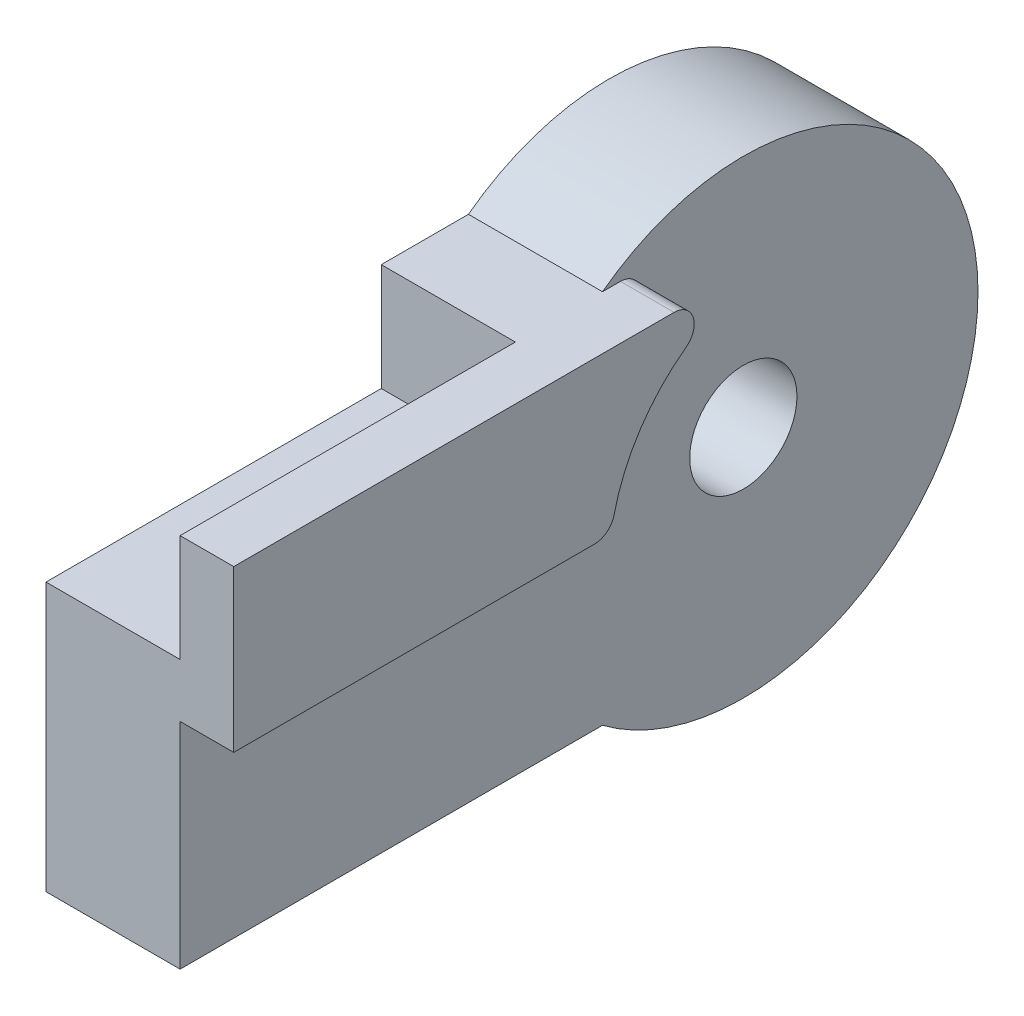
ISO-10303-21;
HEADER;
FILE_DESCRIPTION(('STEP AP214'),'2;1');
FILE_NAME('part.step','',(''),(''),'','','');
FILE_SCHEMA(('AUTOMOTIVE_DESIGN { 1 0 10303 214 1 1 1 1 }'));
ENDSEC;
DATA;
#1=APPLICATION_CONTEXT('core data for automotive mechanical design processes');
#2=APPLICATION_PROTOCOL_DEFINITION('international standard','automotive_design',2000,#1);
#3=PRODUCT_CONTEXT('',#1,'mechanical');
#4=PRODUCT('Part','Part','',(#3));
#5=PRODUCT_RELATED_PRODUCT_CATEGORY('part','',(#4));
#6=PRODUCT_DEFINITION_FORMATION('','',#4);
#7=PRODUCT_DEFINITION_CONTEXT('part definition',#1,'design');
#8=PRODUCT_DEFINITION('design','',#6,#7);
#9=PRODUCT_DEFINITION_SHAPE('','',#8);
#10=(LENGTH_UNIT() NAMED_UNIT(*) SI_UNIT(.MILLI.,.METRE.));
#11=(NAMED_UNIT(*) PLANE_ANGLE_UNIT() SI_UNIT($,.RADIAN.));
#12=(NAMED_UNIT(*) SI_UNIT($,.STERADIAN.) SOLID_ANGLE_UNIT());
#13=UNCERTAINTY_MEASURE_WITH_UNIT(LENGTH_MEASURE(1.E-05),#10,'distance_accuracy_value','');
#14=(GEOMETRIC_REPRESENTATION_CONTEXT(3) GLOBAL_UNCERTAINTY_ASSIGNED_CONTEXT((#13)) GLOBAL_UNIT_ASSIGNED_CONTEXT((#10,
#11,#12)) REPRESENTATION_CONTEXT('',''));
#15=CARTESIAN_POINT('',(0.,0.,0.));
#16=DIRECTION('',(0.,0.,1.));
#17=DIRECTION('',(1.,0.,0.));
#18=AXIS2_PLACEMENT_3D('',#15,#16,#17);
#19=CARTESIAN_POINT('',(0.5,-1.4,0.916515138991168));
#20=DIRECTION('',(-1.,0.,0.));
#21=DIRECTION('',(0.,0.,1.));
#22=AXIS2_PLACEMENT_3D('',#19,#20,#21);
#23=PLANE('',#22);
#24=DIRECTION('',(0.,0.,-1.));
#25=VECTOR('',#24,1.);
#26=CARTESIAN_POINT('',(0.5,1.4,0.));
#27=LINE('',#26,#25);
#28=CARTESIAN_POINT('',(0.5,1.4,1.7));
#29=VERTEX_POINT('',#28);
#30=CARTESIAN_POINT('',(0.5,1.4,1.05));
#31=VERTEX_POINT('',#30);
#32=EDGE_CURVE('E135',#29,#31,#27,.T.);
#33=ORIENTED_EDGE('',*,*,#32,.T.);
#34=CARTESIAN_POINT('',(0.5,0.,0.));
#35=DIRECTION('',(1.,0.,0.));
#36=DIRECTION('',(0.,0.,-1.));
#37=AXIS2_PLACEMENT_3D('',#34,#35,#36);
#38=CIRCLE('',#37,1.75);
#39=CARTESIAN_POINT('',(0.5,-1.4,1.05));
#40=VERTEX_POINT('',#39);
#41=EDGE_CURVE('E127',#31,#40,#38,.F.);
#42=ORIENTED_EDGE('',*,*,#41,.T.);
#43=DIRECTION('',(0.,0.,-1.));
#44=VECTOR('',#43,1.);
#45=CARTESIAN_POINT('',(0.5,-1.4,0.));
#46=LINE('',#45,#44);
#47=CARTESIAN_POINT('',(0.5,-1.4,4.2));
#48=VERTEX_POINT('',#47);
#49=EDGE_CURVE('E131',#48,#40,#46,.T.);
#50=ORIENTED_EDGE('',*,*,#49,.F.);
#51=DIRECTION('',(0.,-1.,0.));
#52=VECTOR('',#51,1.);
#53=CARTESIAN_POINT('',(0.5,0.,4.2));
#54=LINE('',#53,#52);
#55=CARTESIAN_POINT('',(0.5,0.6,4.2));
#56=VERTEX_POINT('',#55);
#57=EDGE_CURVE('E152',#56,#48,#54,.T.);
#58=ORIENTED_EDGE('',*,*,#57,.F.);
#59=DIRECTION('',(0.,0.,1.));
#60=VECTOR('',#59,1.);
#61=CARTESIAN_POINT('',(0.5,0.6,0.));
#62=LINE('',#61,#60);
#63=CARTESIAN_POINT('',(0.5,0.6,1.7));
#64=VERTEX_POINT('',#63);
#65=EDGE_CURVE('E160',#64,#56,#62,.T.);
#66=ORIENTED_EDGE('',*,*,#65,.F.);
#67=DIRECTION('',(0.,-1.,0.));
#68=VECTOR('',#67,1.);
#69=CARTESIAN_POINT('',(0.5,0.,1.7));
#70=LINE('',#69,#68);
#71=EDGE_CURVE('E156',#29,#64,#70,.T.);
#72=ORIENTED_EDGE('',*,*,#71,.F.);
#73=EDGE_LOOP('',(#33,#42,#50,#58,#66,#72));
#74=FACE_BOUND('',#73,.T.);
#75=CARTESIAN_POINT('',(0.5,0.,0.));
#76=DIRECTION('',(1.,0.,0.));
#77=DIRECTION('',(0.,0.,-1.));
#78=AXIS2_PLACEMENT_3D('',#75,#76,#77);
#79=CIRCLE('',#78,0.4);
#80=CARTESIAN_POINT('',(0.5,0.,-0.4));
#81=VERTEX_POINT('',#80);
#82=EDGE_CURVE('E204',#81,#81,#79,.T.);
#83=ORIENTED_EDGE('',*,*,#82,.T.);
#84=EDGE_LOOP('',(#83));
#85=FACE_BOUND('',#84,.T.);
#86=ADVANCED_FACE('F39',(#74,#85),#23,.T.);
#87=CARTESIAN_POINT('',(5.43847096529504,0.6,0.));
#88=DIRECTION('',(0.,1.,0.));
#89=DIRECTION('',(0.,0.,1.));
#90=AXIS2_PLACEMENT_3D('',#87,#88,#89);
#91=PLANE('',#90);
#92=DIRECTION('',(-1.,0.,0.));
#93=VECTOR('',#92,1.);
#94=CARTESIAN_POINT('',(5.43847096529504,0.6,1.7));
#95=LINE('',#94,#93);
#96=CARTESIAN_POINT('',(1.5,0.6,1.7));
#97=VERTEX_POINT('',#96);
#98=EDGE_CURVE('E169',#97,#64,#95,.T.);
#99=ORIENTED_EDGE('',*,*,#98,.T.);
#100=ORIENTED_EDGE('',*,*,#65,.T.);
#101=DIRECTION('',(-1.,0.,0.));
#102=VECTOR('',#101,1.);
#103=CARTESIAN_POINT('',(5.43847096529504,0.6,4.2));
#104=LINE('',#103,#102);
#105=CARTESIAN_POINT('',(1.5,0.6,4.2));
#106=VERTEX_POINT('',#105);
#107=EDGE_CURVE('E172',#106,#56,#104,.T.);
#108=ORIENTED_EDGE('',*,*,#107,.F.);
#109=DIRECTION('',(0.,0.,-1.));
#110=VECTOR('',#109,1.);
#111=CARTESIAN_POINT('',(1.5,0.6,0.));
#112=LINE('',#111,#110);
#113=EDGE_CURVE('E187',#106,#97,#112,.T.);
#114=ORIENTED_EDGE('',*,*,#113,.T.);
#115=EDGE_LOOP('',(#99,#100,#108,#114));
#116=FACE_BOUND('',#115,.T.);
#117=ADVANCED_FACE('F264',(#116),#91,.T.);
#118=CARTESIAN_POINT('',(5.43847096529504,0.,1.7));
#119=DIRECTION('',(0.,0.,1.));
#120=DIRECTION('',(1.,0.,0.));
#121=AXIS2_PLACEMENT_3D('',#118,#119,#120);
#122=PLANE('',#121);
#123=DIRECTION('',(-1.,0.,0.));
#124=VECTOR('',#123,1.);
#125=CARTESIAN_POINT('',(5.43847096529504,1.4,1.7));
#126=LINE('',#125,#124);
#127=CARTESIAN_POINT('',(1.5,1.4,1.7));
#128=VERTEX_POINT('',#127);
#129=EDGE_CURVE('E167',#128,#29,#126,.T.);
#130=ORIENTED_EDGE('',*,*,#129,.T.);
#131=ORIENTED_EDGE('',*,*,#71,.T.);
#132=ORIENTED_EDGE('',*,*,#98,.F.);
#133=DIRECTION('',(0.,1.,0.));
#134=VECTOR('',#133,1.);
#135=CARTESIAN_POINT('',(1.5,0.,1.7));
#136=LINE('',#135,#134);
#137=EDGE_CURVE('E193',#97,#128,#136,.T.);
#138=ORIENTED_EDGE('',*,*,#137,.T.);
#139=EDGE_LOOP('',(#130,#131,#132,#138));
#140=FACE_BOUND('',#139,.T.);
#141=ADVANCED_FACE('F261',(#140),#122,.T.);
#142=CARTESIAN_POINT('',(1.5,0.,4.2));
#143=DIRECTION('',(0.,0.,1.));
#144=DIRECTION('',(1.,0.,0.));
#145=AXIS2_PLACEMENT_3D('',#142,#143,#144);
#146=PLANE('',#145);
#147=ORIENTED_EDGE('',*,*,#107,.T.);
#148=ORIENTED_EDGE('',*,*,#57,.T.);
#149=DIRECTION('',(-1.,0.,0.));
#150=VECTOR('',#149,1.);
#151=CARTESIAN_POINT('',(1.5,-1.4,4.2));
#152=LINE('',#151,#150);
#153=CARTESIAN_POINT('',(1.5,-1.4,4.2));
#154=VERTEX_POINT('',#153);
#155=EDGE_CURVE('E150',#154,#48,#152,.T.);
#156=ORIENTED_EDGE('',*,*,#155,.F.);
#157=DIRECTION('',(0.,1.,0.));
#158=VECTOR('',#157,1.);
#159=CARTESIAN_POINT('',(1.5,0.,4.2));
#160=LINE('',#159,#158);
#161=CARTESIAN_POINT('',(1.5,0.2,4.2));
#162=VERTEX_POINT('',#161);
#163=EDGE_CURVE('E223',#154,#162,#160,.T.);
#164=ORIENTED_EDGE('',*,*,#163,.T.);
#165=DIRECTION('',(-1.,0.,0.));
#166=VECTOR('',#165,1.);
#167=CARTESIAN_POINT('',(5.43847096529504,0.2,4.2));
#168=LINE('',#167,#166);
#169=CARTESIAN_POINT('',(1.9,0.2,4.2));
#170=VERTEX_POINT('',#169);
#171=EDGE_CURVE('E43',#170,#162,#168,.T.);
#172=ORIENTED_EDGE('',*,*,#171,.F.);
#173=DIRECTION('',(0.,1.,0.));
#174=VECTOR('',#173,1.);
#175=CARTESIAN_POINT('',(1.9,0.,4.2));
#176=LINE('',#175,#174);
#177=CARTESIAN_POINT('',(1.9,1.4,4.2));
#178=VERTEX_POINT('',#177);
#179=EDGE_CURVE('E174',#170,#178,#176,.T.);
#180=ORIENTED_EDGE('',*,*,#179,.T.);
#181=DIRECTION('',(-1.,0.,0.));
#182=VECTOR('',#181,1.);
#183=CARTESIAN_POINT('',(1.9,1.4,4.2));
#184=LINE('',#183,#182);
#185=CARTESIAN_POINT('',(1.5,1.4,4.2));
#186=VERTEX_POINT('',#185);
#187=EDGE_CURVE('E56',#178,#186,#184,.T.);
#188=ORIENTED_EDGE('',*,*,#187,.T.);
#189=DIRECTION('',(0.,-1.,0.));
#190=VECTOR('',#189,1.);
#191=CARTESIAN_POINT('',(1.5,0.,4.2));
#192=LINE('',#191,#190);
#193=EDGE_CURVE('E199',#186,#106,#192,.T.);
#194=ORIENTED_EDGE('',*,*,#193,.T.);
#195=EDGE_LOOP('',(#147,#148,#156,#164,#172,#180,#188,#194));
#196=FACE_BOUND('',#195,.T.);
#197=ADVANCED_FACE('F265',(#196),#146,.T.);
#198=CARTESIAN_POINT('',(1.5,-1.4,0.));
#199=DIRECTION('',(0.,-1.,0.));
#200=DIRECTION('',(0.,0.,-1.));
#201=AXIS2_PLACEMENT_3D('',#198,#199,#200);
#202=PLANE('',#201);
#203=ORIENTED_EDGE('',*,*,#155,.T.);
#204=ORIENTED_EDGE('',*,*,#49,.T.);
#205=DIRECTION('',(1.,0.,0.));
#206=VECTOR('',#205,1.);
#207=CARTESIAN_POINT('',(-4.44974746830583,-1.4,1.05));
#208=LINE('',#207,#206);
#209=CARTESIAN_POINT('',(1.5,-1.4,1.05));
#210=VERTEX_POINT('',#209);
#211=EDGE_CURVE('E142',#210,#40,#208,.F.);
#212=ORIENTED_EDGE('',*,*,#211,.F.);
#213=DIRECTION('',(0.,0.,1.));
#214=VECTOR('',#213,1.);
#215=CARTESIAN_POINT('',(1.5,-1.4,0.));
#216=LINE('',#215,#214);
#217=EDGE_CURVE('E165',#210,#154,#216,.T.);
#218=ORIENTED_EDGE('',*,*,#217,.T.);
#219=EDGE_LOOP('',(#203,#204,#212,#218));
#220=FACE_BOUND('',#219,.T.);
#221=ADVANCED_FACE('F41',(#220),#202,.T.);
#222=CARTESIAN_POINT('',(5.43847096529504,1.4,0.));
#223=DIRECTION('',(0.,-1.,0.));
#224=DIRECTION('',(0.,0.,-1.));
#225=AXIS2_PLACEMENT_3D('',#222,#223,#224);
#226=PLANE('',#225);
#227=ORIENTED_EDGE('',*,*,#32,.F.);
#228=ORIENTED_EDGE('',*,*,#129,.F.);
#229=DIRECTION('',(0.,0.,-1.));
#230=VECTOR('',#229,1.);
#231=CARTESIAN_POINT('',(1.5,1.4,0.));
#232=LINE('',#231,#230);
#233=EDGE_CURVE('E197',#186,#128,#232,.T.);
#234=ORIENTED_EDGE('',*,*,#233,.F.);
#235=ORIENTED_EDGE('',*,*,#187,.F.);
#236=DIRECTION('',(0.,0.,1.));
#237=VECTOR('',#236,1.);
#238=CARTESIAN_POINT('',(1.9,1.4,0.));
#239=LINE('',#238,#237);
#240=CARTESIAN_POINT('',(1.9,1.4,0.916515138991168));
#241=VERTEX_POINT('',#240);
#242=EDGE_CURVE('E185',#241,#178,#239,.T.);
#243=ORIENTED_EDGE('',*,*,#242,.F.);
#244=DIRECTION('',(1.,0.,0.));
#245=VECTOR('',#244,1.);
#246=CARTESIAN_POINT('',(1.5,1.4,0.916515138991168));
#247=LINE('',#246,#245);
#248=CARTESIAN_POINT('',(1.5,1.4,0.916515138991168));
#249=VERTEX_POINT('',#248);
#250=EDGE_CURVE('E217',#241,#249,#247,.F.);
#251=ORIENTED_EDGE('',*,*,#250,.T.);
#252=DIRECTION('',(0.,0.,1.));
#253=VECTOR('',#252,1.);
#254=CARTESIAN_POINT('',(1.5,1.4,0.));
#255=LINE('',#254,#253);
#256=CARTESIAN_POINT('',(1.5,1.4,1.05));
#257=VERTEX_POINT('',#256);
#258=EDGE_CURVE('E139',#249,#257,#255,.T.);
#259=ORIENTED_EDGE('',*,*,#258,.T.);
#260=DIRECTION('',(1.,0.,0.));
#261=VECTOR('',#260,1.);
#262=CARTESIAN_POINT('',(-4.44974746830583,1.4,1.05));
#263=LINE('',#262,#261);
#264=EDGE_CURVE('E49',#31,#257,#263,.T.);
#265=ORIENTED_EDGE('',*,*,#264,.F.);
#266=EDGE_LOOP('',(#227,#228,#234,#235,#243,#251,#259,#265));
#267=FACE_BOUND('',#266,.T.);
#268=ADVANCED_FACE('F211',(#267),#226,.F.);
#269=CARTESIAN_POINT('',(1.5,0.,0.));
#270=DIRECTION('',(-1.,0.,0.));
#271=DIRECTION('',(0.,0.,1.));
#272=AXIS2_PLACEMENT_3D('',#269,#270,#271);
#273=CYLINDRICAL_SURFACE('',#272,1.4);
#274=CARTESIAN_POINT('',(1.9,0.,0.));
#275=DIRECTION('',(1.,0.,0.));
#276=DIRECTION('',(0.,0.,-1.));
#277=AXIS2_PLACEMENT_3D('',#274,#275,#276);
#278=CIRCLE('',#277,1.4);
#279=CARTESIAN_POINT('',(1.9,1.12903225806452,0.82782012554041));
#280=VERTEX_POINT('',#279);
#281=CARTESIAN_POINT('',(1.9,0.316129032258065,1.36384105927472));
#282=VERTEX_POINT('',#281);
#283=EDGE_CURVE('E170',#280,#282,#278,.T.);
#284=ORIENTED_EDGE('',*,*,#283,.T.);
#285=DIRECTION('',(-1.,0.,0.));
#286=VECTOR('',#285,1.);
#287=CARTESIAN_POINT('',(1.5,0.316129032258065,1.36384105927472));
#288=LINE('',#287,#286);
#289=CARTESIAN_POINT('',(1.5,0.316129032258065,1.36384105927472));
#290=VERTEX_POINT('',#289);
#291=EDGE_CURVE('E227',#282,#290,#288,.T.);
#292=ORIENTED_EDGE('',*,*,#291,.T.);
#293=CARTESIAN_POINT('',(1.5,0.,0.));
#294=DIRECTION('',(1.,0.,0.));
#295=DIRECTION('',(0.,0.,-1.));
#296=AXIS2_PLACEMENT_3D('',#293,#294,#295);
#297=CIRCLE('',#296,1.4);
#298=CARTESIAN_POINT('',(1.5,1.12903225806452,0.82782012554041));
#299=VERTEX_POINT('',#298);
#300=EDGE_CURVE('E201',#299,#290,#297,.T.);
#301=ORIENTED_EDGE('',*,*,#300,.F.);
#302=DIRECTION('',(-1.,0.,0.));
#303=VECTOR('',#302,1.);
#304=CARTESIAN_POINT('',(1.5,1.12903225806452,0.82782012554041));
#305=LINE('',#304,#303);
#306=EDGE_CURVE('E166',#299,#280,#305,.F.);
#307=ORIENTED_EDGE('',*,*,#306,.T.);
#308=EDGE_LOOP('',(#284,#292,#301,#307));
#309=FACE_BOUND('',#308,.T.);
#310=ADVANCED_FACE('F252',(#309),#273,.F.);
#311=CARTESIAN_POINT('',(1.5,0.,0.));
#312=DIRECTION('',(1.,0.,0.));
#313=DIRECTION('',(0.,0.,-1.));
#314=AXIS2_PLACEMENT_3D('',#311,#312,#313);
#315=PLANE('',#314);
#316=ORIENTED_EDGE('',*,*,#217,.F.);
#317=CARTESIAN_POINT('',(1.5,0.,0.));
#318=DIRECTION('',(1.,0.,0.));
#319=DIRECTION('',(0.,0.,-1.));
#320=AXIS2_PLACEMENT_3D('',#317,#318,#319);
#321=CIRCLE('',#320,1.75);
#322=EDGE_CURVE('E11',#210,#257,#321,.T.);
#323=ORIENTED_EDGE('',*,*,#322,.T.);
#324=ORIENTED_EDGE('',*,*,#258,.F.);
#325=CARTESIAN_POINT('',(1.5,1.25,0.916515138991168));
#326=DIRECTION('',(1.,0.,0.));
#327=DIRECTION('',(0.,0.,-1.));
#328=AXIS2_PLACEMENT_3D('',#325,#326,#327);
#329=CIRCLE('',#328,0.15);
#330=EDGE_CURVE('E151',#249,#299,#329,.F.);
#331=ORIENTED_EDGE('',*,*,#330,.T.);
#332=ORIENTED_EDGE('',*,*,#300,.T.);
#333=CARTESIAN_POINT('',(1.5,0.35,1.50996688705415));
#334=DIRECTION('',(1.,0.,0.));
#335=DIRECTION('',(0.,0.,-1.));
#336=AXIS2_PLACEMENT_3D('',#333,#334,#335);
#337=CIRCLE('',#336,0.15);
#338=CARTESIAN_POINT('',(1.5,0.2,1.50996688705415));
#339=VERTEX_POINT('',#338);
#340=EDGE_CURVE('E154',#290,#339,#337,.F.);
#341=ORIENTED_EDGE('',*,*,#340,.T.);
#342=DIRECTION('',(0.,0.,1.));
#343=VECTOR('',#342,1.);
#344=CARTESIAN_POINT('',(1.5,0.200000000000001,0.));
#345=LINE('',#344,#343);
#346=EDGE_CURVE('E183',#339,#162,#345,.T.);
#347=ORIENTED_EDGE('',*,*,#346,.T.);
#348=ORIENTED_EDGE('',*,*,#163,.F.);
#349=EDGE_LOOP('',(#316,#323,#324,#331,#332,#341,#347,#348));
#350=FACE_BOUND('',#349,.T.);
#351=CARTESIAN_POINT('',(1.5,0.,0.));
#352=DIRECTION('',(1.,0.,0.));
#353=DIRECTION('',(0.,0.,-1.));
#354=AXIS2_PLACEMENT_3D('',#351,#352,#353);
#355=CIRCLE('',#354,0.4);
#356=CARTESIAN_POINT('',(1.5,0.,-0.4));
#357=VERTEX_POINT('',#356);
#358=EDGE_CURVE('E146',#357,#357,#355,.T.);
#359=ORIENTED_EDGE('',*,*,#358,.F.);
#360=EDGE_LOOP('',(#359));
#361=FACE_BOUND('',#360,.T.);
#362=ADVANCED_FACE('F219',(#350,#361),#315,.T.);
#363=CARTESIAN_POINT('',(5.43847096529504,0.200000000000001,0.));
#364=DIRECTION('',(0.,-1.,0.));
#365=DIRECTION('',(0.,0.,-1.));
#366=AXIS2_PLACEMENT_3D('',#363,#364,#365);
#367=PLANE('',#366);
#368=ORIENTED_EDGE('',*,*,#346,.F.);
#369=DIRECTION('',(-1.,0.,0.));
#370=VECTOR('',#369,1.);
#371=CARTESIAN_POINT('',(5.43847096529504,0.2,1.50996688705415));
#372=LINE('',#371,#370);
#373=CARTESIAN_POINT('',(1.9,0.2,1.50996688705415));
#374=VERTEX_POINT('',#373);
#375=EDGE_CURVE('E230',#339,#374,#372,.F.);
#376=ORIENTED_EDGE('',*,*,#375,.T.);
#377=DIRECTION('',(0.,0.,1.));
#378=VECTOR('',#377,1.);
#379=CARTESIAN_POINT('',(1.9,0.200000000000001,0.));
#380=LINE('',#379,#378);
#381=EDGE_CURVE('E180',#374,#170,#380,.T.);
#382=ORIENTED_EDGE('',*,*,#381,.T.);
#383=ORIENTED_EDGE('',*,*,#171,.T.);
#384=EDGE_LOOP('',(#368,#376,#382,#383));
#385=FACE_BOUND('',#384,.T.);
#386=ADVANCED_FACE('F243',(#385),#367,.T.);
#387=CARTESIAN_POINT('',(1.9,0.,0.));
#388=DIRECTION('',(1.,0.,0.));
#389=DIRECTION('',(0.,0.,-1.));
#390=AXIS2_PLACEMENT_3D('',#387,#388,#389);
#391=PLANE('',#390);
#392=ORIENTED_EDGE('',*,*,#381,.F.);
#393=CARTESIAN_POINT('',(1.9,0.35,1.50996688705415));
#394=DIRECTION('',(1.,0.,0.));
#395=DIRECTION('',(0.,0.,-1.));
#396=AXIS2_PLACEMENT_3D('',#393,#394,#395);
#397=CIRCLE('',#396,0.15);
#398=EDGE_CURVE('E234',#374,#282,#397,.T.);
#399=ORIENTED_EDGE('',*,*,#398,.T.);
#400=ORIENTED_EDGE('',*,*,#283,.F.);
#401=CARTESIAN_POINT('',(1.9,1.25,0.916515138991168));
#402=DIRECTION('',(1.,0.,0.));
#403=DIRECTION('',(0.,0.,-1.));
#404=AXIS2_PLACEMENT_3D('',#401,#402,#403);
#405=CIRCLE('',#404,0.15);
#406=EDGE_CURVE('E232',#280,#241,#405,.T.);
#407=ORIENTED_EDGE('',*,*,#406,.T.);
#408=ORIENTED_EDGE('',*,*,#242,.T.);
#409=ORIENTED_EDGE('',*,*,#179,.F.);
#410=EDGE_LOOP('',(#392,#399,#400,#407,#408,#409));
#411=FACE_BOUND('',#410,.T.);
#412=ADVANCED_FACE('F249',(#411),#391,.T.);
#413=CARTESIAN_POINT('',(1.5,0.,0.));
#414=DIRECTION('',(1.,0.,0.));
#415=DIRECTION('',(0.,0.,-1.));
#416=AXIS2_PLACEMENT_3D('',#413,#414,#415);
#417=PLANE('',#416);
#418=ORIENTED_EDGE('',*,*,#113,.F.);
#419=ORIENTED_EDGE('',*,*,#193,.F.);
#420=ORIENTED_EDGE('',*,*,#233,.T.);
#421=ORIENTED_EDGE('',*,*,#137,.F.);
#422=EDGE_LOOP('',(#418,#419,#420,#421));
#423=FACE_BOUND('',#422,.T.);
#424=ADVANCED_FACE('F258',(#423),#417,.F.);
#425=CARTESIAN_POINT('',(0.5,0.,0.));
#426=DIRECTION('',(1.,0.,0.));
#427=DIRECTION('',(0.,0.,-1.));
#428=AXIS2_PLACEMENT_3D('',#425,#426,#427);
#429=CYLINDRICAL_SURFACE('',#428,0.4);
#430=ORIENTED_EDGE('',*,*,#82,.F.);
#431=EDGE_LOOP('',(#430));
#432=FACE_BOUND('',#431,.T.);
#433=ORIENTED_EDGE('',*,*,#358,.T.);
#434=EDGE_LOOP('',(#433));
#435=FACE_BOUND('',#434,.T.);
#436=ADVANCED_FACE('F296',(#432,#435),#429,.F.);
#437=CARTESIAN_POINT('',(-4.44974746830583,0.,0.));
#438=DIRECTION('',(1.,0.,0.));
#439=DIRECTION('',(0.,0.,-1.));
#440=AXIS2_PLACEMENT_3D('',#437,#438,#439);
#441=CYLINDRICAL_SURFACE('',#440,1.75);
#442=ORIENTED_EDGE('',*,*,#322,.F.);
#443=ORIENTED_EDGE('',*,*,#211,.T.);
#444=ORIENTED_EDGE('',*,*,#41,.F.);
#445=ORIENTED_EDGE('',*,*,#264,.T.);
#446=EDGE_LOOP('',(#442,#443,#444,#445));
#447=FACE_BOUND('',#446,.T.);
#448=ADVANCED_FACE('F143',(#447),#441,.T.);
#449=CARTESIAN_POINT('',(1.5,0.35,1.50996688705415));
#450=DIRECTION('',(-1.,0.,0.));
#451=DIRECTION('',(0.,0.,1.));
#452=AXIS2_PLACEMENT_3D('',#449,#450,#451);
#453=CYLINDRICAL_SURFACE('',#452,0.15);
#454=ORIENTED_EDGE('',*,*,#398,.F.);
#455=ORIENTED_EDGE('',*,*,#375,.F.);
#456=ORIENTED_EDGE('',*,*,#340,.F.);
#457=ORIENTED_EDGE('',*,*,#291,.F.);
#458=EDGE_LOOP('',(#454,#455,#456,#457));
#459=FACE_BOUND('',#458,.T.);
#460=ADVANCED_FACE('F246',(#459),#453,.T.);
#461=CARTESIAN_POINT('',(1.5,1.25,0.916515138991168));
#462=DIRECTION('',(-1.,0.,0.));
#463=DIRECTION('',(0.,0.,1.));
#464=AXIS2_PLACEMENT_3D('',#461,#462,#463);
#465=CYLINDRICAL_SURFACE('',#464,0.15);
#466=ORIENTED_EDGE('',*,*,#406,.F.);
#467=ORIENTED_EDGE('',*,*,#306,.F.);
#468=ORIENTED_EDGE('',*,*,#330,.F.);
#469=ORIENTED_EDGE('',*,*,#250,.F.);
#470=EDGE_LOOP('',(#466,#467,#468,#469));
#471=FACE_BOUND('',#470,.T.);
#472=ADVANCED_FACE('F255',(#471),#465,.T.);
#473=CLOSED_SHELL('',(#86,#117,#141,#197,#221,#268,#310,#362,#386,#412,#424,#436,#448,#460,#472));
#474=MANIFOLD_SOLID_BREP('B2',#473);
#475=ADVANCED_BREP_SHAPE_REPRESENTATION('',(#18,#474),#14);
#476=SHAPE_DEFINITION_REPRESENTATION(#9,#475);
ENDSEC;
END-ISO-10303-21;
